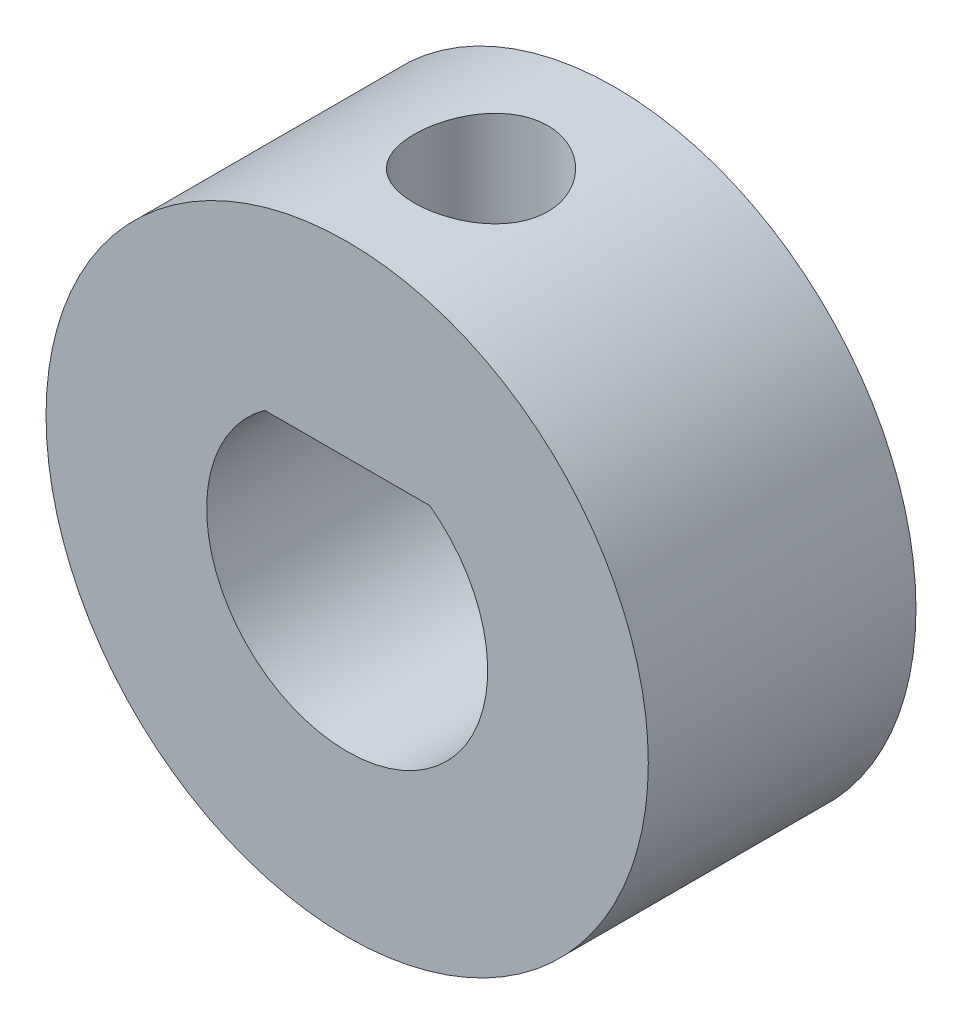
ISO-10303-21;
HEADER;
FILE_DESCRIPTION(('STEP AP214'),'2;1');
FILE_NAME('part.step','',(''),(''),'','','');
FILE_SCHEMA(('AUTOMOTIVE_DESIGN { 1 0 10303 214 1 1 1 1 }'));
ENDSEC;
DATA;
#1=APPLICATION_CONTEXT('core data for automotive mechanical design processes');
#2=APPLICATION_PROTOCOL_DEFINITION('international standard','automotive_design',2000,#1);
#3=PRODUCT_CONTEXT('',#1,'mechanical');
#4=PRODUCT('Part','Part','',(#3));
#5=PRODUCT_RELATED_PRODUCT_CATEGORY('part','',(#4));
#6=PRODUCT_DEFINITION_FORMATION('','',#4);
#7=PRODUCT_DEFINITION_CONTEXT('part definition',#1,'design');
#8=PRODUCT_DEFINITION('design','',#6,#7);
#9=PRODUCT_DEFINITION_SHAPE('','',#8);
#10=(LENGTH_UNIT() NAMED_UNIT(*) SI_UNIT(.MILLI.,.METRE.));
#11=(NAMED_UNIT(*) PLANE_ANGLE_UNIT() SI_UNIT($,.RADIAN.));
#12=(NAMED_UNIT(*) SI_UNIT($,.STERADIAN.) SOLID_ANGLE_UNIT());
#13=UNCERTAINTY_MEASURE_WITH_UNIT(LENGTH_MEASURE(1.E-05),#10,'distance_accuracy_value','');
#14=(GEOMETRIC_REPRESENTATION_CONTEXT(3) GLOBAL_UNCERTAINTY_ASSIGNED_CONTEXT((#13)) GLOBAL_UNIT_ASSIGNED_CONTEXT((#10,
#11,#12)) REPRESENTATION_CONTEXT('',''));
#15=CARTESIAN_POINT('',(0.,0.,0.));
#16=DIRECTION('',(0.,0.,1.));
#17=DIRECTION('',(1.,0.,0.));
#18=AXIS2_PLACEMENT_3D('',#15,#16,#17);
#19=CARTESIAN_POINT('',(0.,0.,4.));
#20=DIRECTION('',(0.,0.,-1.));
#21=DIRECTION('',(-1.,0.,0.));
#22=AXIS2_PLACEMENT_3D('',#19,#20,#21);
#23=CYLINDRICAL_SURFACE('',#22,4.5);
#24=CARTESIAN_POINT('',(0.,0.,4.));
#25=DIRECTION('',(0.,0.,1.));
#26=DIRECTION('',(1.,0.,0.));
#27=AXIS2_PLACEMENT_3D('',#24,#25,#26);
#28=CIRCLE('',#27,4.5);
#29=CARTESIAN_POINT('',(4.5,0.,4.));
#30=VERTEX_POINT('',#29);
#31=EDGE_CURVE('E75',#30,#30,#28,.T.);
#32=ORIENTED_EDGE('',*,*,#31,.F.);
#33=EDGE_LOOP('',(#32));
#34=FACE_BOUND('',#33,.T.);
#35=CARTESIAN_POINT('',(0.,0.,0.));
#36=DIRECTION('',(0.,0.,1.));
#37=DIRECTION('',(1.,0.,0.));
#38=AXIS2_PLACEMENT_3D('',#35,#36,#37);
#39=CIRCLE('',#38,4.5);
#40=CARTESIAN_POINT('',(4.5,0.,0.));
#41=VERTEX_POINT('',#40);
#42=EDGE_CURVE('E80',#41,#41,#39,.T.);
#43=ORIENTED_EDGE('',*,*,#42,.T.);
#44=EDGE_LOOP('',(#43));
#45=FACE_BOUND('',#44,.T.);
#46=CARTESIAN_POINT('',(0.,4.5,1.));
#47=CARTESIAN_POINT('',(-0.0554402383878239,4.49999898109126,1.00000186183991));
#48=CARTESIAN_POINT('',(-0.11090278263481,4.49896506997846,1.00462599083174));
#49=CARTESIAN_POINT('',(-0.220250972051567,4.49494048878835,1.02298023617528));
#50=CARTESIAN_POINT('',(-0.274135487569494,4.49194845108674,1.03671671700464));
#51=CARTESIAN_POINT('',(-0.378731638880764,4.48434056584504,1.07284298524583));
#52=CARTESIAN_POINT('',(-0.429446576050142,4.47972644219541,1.09522358849894));
#53=CARTESIAN_POINT('',(-0.52640009015688,4.46937167720689,1.1479733062362));
#54=CARTESIAN_POINT('',(-0.572638753966673,4.46363105773679,1.17834226564531));
#55=CARTESIAN_POINT('',(-0.660093157007017,4.45154547087105,1.24673783255334));
#56=CARTESIAN_POINT('',(-0.701224306021767,4.44519280820714,1.28487125106757));
#57=CARTESIAN_POINT('',(-0.776562455229185,4.43265300539893,1.36748403004657));
#58=CARTESIAN_POINT('',(-0.810768822054276,4.42646588044024,1.41196397035523));
#59=CARTESIAN_POINT('',(-0.871662217051752,4.41488164130856,1.50663592202915));
#60=CARTESIAN_POINT('',(-0.898258710522017,4.40949437871491,1.55688747902077));
#61=CARTESIAN_POINT('',(-0.94259649477254,4.40023048176198,1.66128638084621));
#62=CARTESIAN_POINT('',(-0.96033888110048,4.39635366052386,1.71543324275213));
#63=CARTESIAN_POINT('',(-0.986184290032021,4.39062804729594,1.82516673866133));
#64=CARTESIAN_POINT('',(-0.994437335190343,4.38874772903892,1.88071635755271));
#65=CARTESIAN_POINT('',(-1.00153635498836,4.38713336865335,1.9924411088931));
#66=CARTESIAN_POINT('',(-1.00038352455831,4.38739905389469,2.04861616098107));
#67=CARTESIAN_POINT('',(-0.988824137586509,4.39001816074073,2.1588783135969));
#68=CARTESIAN_POINT('',(-0.978592322301085,4.3923321569242,2.21298481206967));
#69=CARTESIAN_POINT('',(-0.94944245340573,4.39872477095838,2.3186935716625));
#70=CARTESIAN_POINT('',(-0.930523898408257,4.40280349066588,2.3702956880427));
#71=CARTESIAN_POINT('',(-0.884378364364373,4.41230454985148,2.47001971919094));
#72=CARTESIAN_POINT('',(-0.857084596896763,4.41773762181245,2.51810966366804));
#73=CARTESIAN_POINT('',(-0.795010340699248,4.42932868955372,2.60909143525795));
#74=CARTESIAN_POINT('',(-0.760228800371371,4.43548678710298,2.65198253091007));
#75=CARTESIAN_POINT('',(-0.683243418514914,4.44800287306333,2.73235465467424));
#76=CARTESIAN_POINT('',(-0.640891102633116,4.45436225343936,2.76969339255253));
#77=CARTESIAN_POINT('',(-0.550453309045809,4.46643919561158,2.83676186445356));
#78=CARTESIAN_POINT('',(-0.502367720918685,4.47215674504213,2.86649145189095));
#79=CARTESIAN_POINT('',(-0.401651595367367,4.48232532116804,2.9175346378884));
#80=CARTESIAN_POINT('',(-0.349011061159926,4.4867734650383,2.93882912215413));
#81=CARTESIAN_POINT('',(-0.240777965490728,4.49388068183127,2.97223050652894));
#82=CARTESIAN_POINT('',(-0.185185848796682,4.49654002348392,2.98433878670706));
#83=CARTESIAN_POINT('',(-0.0738477416404218,4.49973158880836,2.99881600662759));
#84=CARTESIAN_POINT('',(-0.0181281986594518,4.50030624311145,3.00137925008084));
#85=CARTESIAN_POINT('',(0.0929429619640406,4.49938279325299,2.99722094786982));
#86=CARTESIAN_POINT('',(0.148294605135324,4.4978848344523,2.99050005334028));
#87=CARTESIAN_POINT('',(0.256411628664711,4.49301129379307,2.96812529241595));
#88=CARTESIAN_POINT('',(0.309199245857742,4.4896572350388,2.95257377188828));
#89=CARTESIAN_POINT('',(0.411416402927916,4.48144710543397,2.91309315627746));
#90=CARTESIAN_POINT('',(0.460845650005089,4.4765909038233,2.889163331847));
#91=CARTESIAN_POINT('',(0.55574321994719,4.4658107661382,2.83320356160051));
#92=CARTESIAN_POINT('',(0.601142865416124,4.45987222295123,2.80106002849692));
#93=CARTESIAN_POINT('',(0.68597348249406,4.4476151617454,2.72973437544928));
#94=CARTESIAN_POINT('',(0.725403650867064,4.44129659275087,2.69055130983395));
#95=CARTESIAN_POINT('',(0.797947740954927,4.42884439472905,2.60536598320965));
#96=CARTESIAN_POINT('',(0.830926909700367,4.42271658832142,2.5592479549967));
#97=CARTESIAN_POINT('',(0.88867305961376,4.41147697689154,2.46201398279459));
#98=CARTESIAN_POINT('',(0.913440399634868,4.40636512747635,2.41089825732895));
#99=CARTESIAN_POINT('',(0.953890009481296,4.39778600274463,2.30539585544743));
#100=CARTESIAN_POINT('',(0.969623931773795,4.39430939829893,2.25102977886558));
#101=CARTESIAN_POINT('',(0.99171013829203,4.38937824848696,2.14033790756876));
#102=CARTESIAN_POINT('',(0.998063978591781,4.38792336773666,2.08401243948702));
#103=CARTESIAN_POINT('',(1.00114178320522,4.38722200724489,1.97236056086084));
#104=CARTESIAN_POINT('',(0.998079565719667,4.38792649185062,1.91704024596997));
#105=CARTESIAN_POINT('',(0.982891385608439,4.39135332478774,1.80772514501659));
#106=CARTESIAN_POINT('',(0.970765537001197,4.39407564773517,1.75373034228826));
#107=CARTESIAN_POINT('',(0.937899099903722,4.40120714065762,1.64877543988631));
#108=CARTESIAN_POINT('',(0.917190583142268,4.40561002591385,1.5978048415592));
#109=CARTESIAN_POINT('',(0.86777385174171,4.41560882234529,1.50003000372664));
#110=CARTESIAN_POINT('',(0.839064772925968,4.42120486238316,1.45322621501799));
#111=CARTESIAN_POINT('',(0.77375679495279,4.43310521417665,1.36406169552601));
#112=CARTESIAN_POINT('',(0.737005927555191,4.4394218568387,1.32181389753867));
#113=CARTESIAN_POINT('',(0.65696435297252,4.45196987086694,1.24401496303434));
#114=CARTESIAN_POINT('',(0.613672133116717,4.45820122214526,1.20846537974579));
#115=CARTESIAN_POINT('',(0.521072985322783,4.46997629863291,1.14461200854004));
#116=CARTESIAN_POINT('',(0.471692818317474,4.47550961749614,1.11641240013253));
#117=CARTESIAN_POINT('',(0.368780139889409,4.48516029184624,1.0687583479094));
#118=CARTESIAN_POINT('',(0.315251101656497,4.48927881635408,1.04929667997692));
#119=CARTESIAN_POINT('',(0.218069123864704,4.49491406454777,1.02307932486161));
#120=CARTESIAN_POINT('',(0.17493599595084,4.49680934511605,1.01444131316686));
#121=CARTESIAN_POINT('',(0.0878732249472637,4.49935268729894,1.00290104784692));
#122=CARTESIAN_POINT('',(0.0439436194464391,4.50000080761806,0.999998524249048));
#123=CARTESIAN_POINT('',(0.,4.5,1.));
#124=B_SPLINE_CURVE_WITH_KNOTS('',3,(#46,#47,#48,#49,#50,#51,#52,#53,#54,#55,#56,#57,#58,#59,
#60,#61,#62,#63,#64,#65,#66,#67,#68,#69,#70,#71,#72,#73,#74,#75,#76,#77,#78,#79,#80,#81,#82,#83,
#84,#85,#86,#87,#88,#89,#90,#91,#92,#93,#94,#95,#96,#97,#98,#99,#100,#101,#102,#103,#104,#105,
#106,#107,#108,#109,#110,#111,#112,#113,#114,#115,#116,#117,#118,#119,#120,#121,#122,#123),
.UNSPECIFIED.,.T.,.F.,(4,2,2,2,2,2,2,2,2,2,2,2,2,2,2,2,2,2,2,2,2,2,2,2,2,2,2,2,2,2,2,2,2,2,2,2,
2,2,4),(0.,0.166159844864898,0.332435865624642,0.498535706203729,0.664632322584946,
0.833190360010395,1.00176380745257,1.17226648148988,1.3427480534387,1.51049562819053,
1.67822189248295,1.84278834072892,2.0073642887347,2.17328834854791,2.3392357262915,
2.50889089904488,2.67854933984914,2.84859006405619,3.01860523750994,3.18513996062134,
3.35166300456134,3.51629434712583,3.6809400247273,3.84799901631021,4.01508046693878,
4.18534736552864,4.35560682255206,4.52488279527622,4.69413068343205,4.85956392571208,
5.02499508691429,5.1898135600789,5.35464984293193,5.52292163156412,5.69123239233205,
5.86181293524784,6.03225218935468,6.16396173679278,6.29566508443975),.UNSPECIFIED.);
#125=CARTESIAN_POINT('',(0.,4.5,1.));
#126=VERTEX_POINT('',#125);
#127=EDGE_CURVE('E11',#126,#126,#124,.T.);
#128=ORIENTED_EDGE('',*,*,#127,.F.);
#129=EDGE_LOOP('',(#128));
#130=FACE_BOUND('',#129,.T.);
#131=ADVANCED_FACE('F37',(#34,#45,#130),#23,.T.);
#132=CARTESIAN_POINT('',(0.,0.,4.));
#133=DIRECTION('',(0.,0.,-1.));
#134=DIRECTION('',(-1.,0.,0.));
#135=AXIS2_PLACEMENT_3D('',#132,#133,#134);
#136=CYLINDRICAL_SURFACE('',#135,2.1);
#137=CARTESIAN_POINT('',(0.,0.,0.));
#138=DIRECTION('',(0.,0.,1.));
#139=DIRECTION('',(1.,0.,0.));
#140=AXIS2_PLACEMENT_3D('',#137,#138,#139);
#141=CIRCLE('',#140,2.1);
#142=CARTESIAN_POINT('',(-1.2328828005938,1.7,0.));
#143=VERTEX_POINT('',#142);
#144=CARTESIAN_POINT('',(1.2328828005938,1.7,0.));
#145=VERTEX_POINT('',#144);
#146=EDGE_CURVE('E73',#143,#145,#141,.T.);
#147=ORIENTED_EDGE('',*,*,#146,.F.);
#148=DIRECTION('',(0.,0.,-1.));
#149=VECTOR('',#148,1.);
#150=CARTESIAN_POINT('',(-1.2328828005938,1.7,4.));
#151=LINE('',#150,#149);
#152=CARTESIAN_POINT('',(-1.2328828005938,1.7,4.));
#153=VERTEX_POINT('',#152);
#154=EDGE_CURVE('E51',#153,#143,#151,.T.);
#155=ORIENTED_EDGE('',*,*,#154,.F.);
#156=CARTESIAN_POINT('',(0.,0.,4.));
#157=DIRECTION('',(0.,0.,1.));
#158=DIRECTION('',(1.,0.,0.));
#159=AXIS2_PLACEMENT_3D('',#156,#157,#158);
#160=CIRCLE('',#159,2.1);
#161=CARTESIAN_POINT('',(1.2328828005938,1.7,4.));
#162=VERTEX_POINT('',#161);
#163=EDGE_CURVE('E74',#153,#162,#160,.T.);
#164=ORIENTED_EDGE('',*,*,#163,.T.);
#165=DIRECTION('',(0.,0.,-1.));
#166=VECTOR('',#165,1.);
#167=CARTESIAN_POINT('',(1.2328828005938,1.7,4.));
#168=LINE('',#167,#166);
#169=EDGE_CURVE('E71',#162,#145,#168,.T.);
#170=ORIENTED_EDGE('',*,*,#169,.T.);
#171=EDGE_LOOP('',(#147,#155,#164,#170));
#172=FACE_BOUND('',#171,.T.);
#173=ADVANCED_FACE('F39',(#172),#136,.F.);
#174=CARTESIAN_POINT('',(0.,1.7,4.));
#175=DIRECTION('',(0.,1.,0.));
#176=DIRECTION('',(0.,0.,1.));
#177=AXIS2_PLACEMENT_3D('',#174,#175,#176);
#178=PLANE('',#177);
#179=CARTESIAN_POINT('',(0.,1.7,2.));
#180=DIRECTION('',(0.,1.,0.));
#181=DIRECTION('',(0.,0.,1.));
#182=AXIS2_PLACEMENT_3D('',#179,#180,#181);
#183=CIRCLE('',#182,1.);
#184=CARTESIAN_POINT('',(0.,1.7,3.));
#185=VERTEX_POINT('',#184);
#186=EDGE_CURVE('E84',#185,#185,#183,.F.);
#187=ORIENTED_EDGE('',*,*,#186,.F.);
#188=EDGE_LOOP('',(#187));
#189=FACE_BOUND('',#188,.T.);
#190=DIRECTION('',(1.,0.,0.));
#191=VECTOR('',#190,1.);
#192=CARTESIAN_POINT('',(0.,1.7,0.));
#193=LINE('',#192,#191);
#194=EDGE_CURVE('E77',#143,#145,#193,.T.);
#195=ORIENTED_EDGE('',*,*,#194,.T.);
#196=ORIENTED_EDGE('',*,*,#169,.F.);
#197=DIRECTION('',(1.,0.,0.));
#198=VECTOR('',#197,1.);
#199=CARTESIAN_POINT('',(0.,1.7,4.));
#200=LINE('',#199,#198);
#201=EDGE_CURVE('E58',#153,#162,#200,.T.);
#202=ORIENTED_EDGE('',*,*,#201,.F.);
#203=ORIENTED_EDGE('',*,*,#154,.T.);
#204=EDGE_LOOP('',(#195,#196,#202,#203));
#205=FACE_BOUND('',#204,.T.);
#206=ADVANCED_FACE('F78',(#189,#205),#178,.F.);
#207=CARTESIAN_POINT('',(0.,0.,4.));
#208=DIRECTION('',(0.,0.,1.));
#209=DIRECTION('',(1.,0.,0.));
#210=AXIS2_PLACEMENT_3D('',#207,#208,#209);
#211=PLANE('',#210);
#212=ORIENTED_EDGE('',*,*,#163,.F.);
#213=ORIENTED_EDGE('',*,*,#201,.T.);
#214=EDGE_LOOP('',(#212,#213));
#215=FACE_BOUND('',#214,.T.);
#216=ORIENTED_EDGE('',*,*,#31,.T.);
#217=EDGE_LOOP('',(#216));
#218=FACE_BOUND('',#217,.T.);
#219=ADVANCED_FACE('F98',(#215,#218),#211,.T.);
#220=CARTESIAN_POINT('',(0.,0.,0.));
#221=DIRECTION('',(0.,0.,1.));
#222=DIRECTION('',(1.,0.,0.));
#223=AXIS2_PLACEMENT_3D('',#220,#221,#222);
#224=PLANE('',#223);
#225=ORIENTED_EDGE('',*,*,#146,.T.);
#226=ORIENTED_EDGE('',*,*,#194,.F.);
#227=EDGE_LOOP('',(#225,#226));
#228=FACE_BOUND('',#227,.T.);
#229=ORIENTED_EDGE('',*,*,#42,.F.);
#230=EDGE_LOOP('',(#229));
#231=FACE_BOUND('',#230,.T.);
#232=ADVANCED_FACE('F82',(#228,#231),#224,.F.);
#233=CARTESIAN_POINT('',(0.,4.5,2.));
#234=DIRECTION('',(0.,-1.,0.));
#235=DIRECTION('',(0.,0.,-1.));
#236=AXIS2_PLACEMENT_3D('',#233,#234,#235);
#237=CYLINDRICAL_SURFACE('',#236,1.);
#238=ORIENTED_EDGE('',*,*,#127,.T.);
#239=EDGE_LOOP('',(#238));
#240=FACE_BOUND('',#239,.T.);
#241=ORIENTED_EDGE('',*,*,#186,.T.);
#242=EDGE_LOOP('',(#241));
#243=FACE_BOUND('',#242,.T.);
#244=ADVANCED_FACE('F104',(#240,#243),#237,.F.);
#245=CLOSED_SHELL('',(#131,#173,#206,#219,#232,#244));
#246=MANIFOLD_SOLID_BREP('B2',#245);
#247=ADVANCED_BREP_SHAPE_REPRESENTATION('',(#18,#246),#14);
#248=SHAPE_DEFINITION_REPRESENTATION(#9,#247);
ENDSEC;
END-ISO-10303-21;
